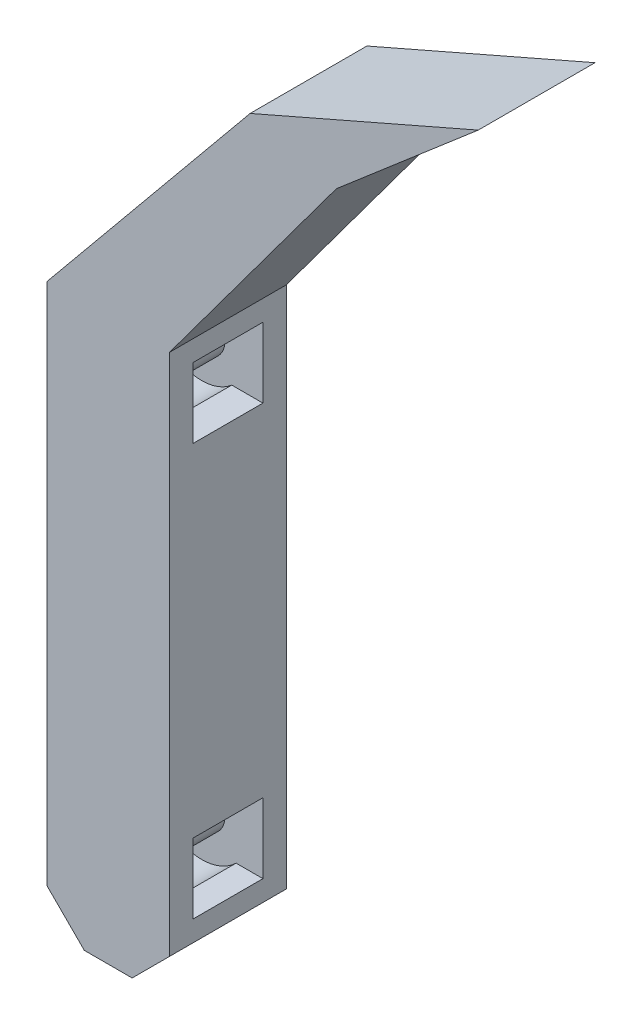
ISO-10303-21;
HEADER;
FILE_DESCRIPTION(('STEP AP214'),'2;1');
FILE_NAME('part.step','',(''),(''),'','','');
FILE_SCHEMA(('AUTOMOTIVE_DESIGN { 1 0 10303 214 1 1 1 1 }'));
ENDSEC;
DATA;
#1=APPLICATION_CONTEXT('core data for automotive mechanical design processes');
#2=APPLICATION_PROTOCOL_DEFINITION('international standard','automotive_design',2000,#1);
#3=PRODUCT_CONTEXT('',#1,'mechanical');
#4=PRODUCT('Part','Part','',(#3));
#5=PRODUCT_RELATED_PRODUCT_CATEGORY('part','',(#4));
#6=PRODUCT_DEFINITION_FORMATION('','',#4);
#7=PRODUCT_DEFINITION_CONTEXT('part definition',#1,'design');
#8=PRODUCT_DEFINITION('design','',#6,#7);
#9=PRODUCT_DEFINITION_SHAPE('','',#8);
#10=(LENGTH_UNIT() NAMED_UNIT(*) SI_UNIT(.MILLI.,.METRE.));
#11=(NAMED_UNIT(*) PLANE_ANGLE_UNIT() SI_UNIT($,.RADIAN.));
#12=(NAMED_UNIT(*) SI_UNIT($,.STERADIAN.) SOLID_ANGLE_UNIT());
#13=UNCERTAINTY_MEASURE_WITH_UNIT(LENGTH_MEASURE(1.E-05),#10,'distance_accuracy_value','');
#14=(GEOMETRIC_REPRESENTATION_CONTEXT(3) GLOBAL_UNCERTAINTY_ASSIGNED_CONTEXT((#13)) GLOBAL_UNIT_ASSIGNED_CONTEXT((#10,
#11,#12)) REPRESENTATION_CONTEXT('',''));
#15=CARTESIAN_POINT('',(0.,0.,0.));
#16=DIRECTION('',(0.,0.,1.));
#17=DIRECTION('',(1.,0.,0.));
#18=AXIS2_PLACEMENT_3D('',#15,#16,#17);
#19=CARTESIAN_POINT('',(82.7839757560862,68.0338828579903,0.));
#20=DIRECTION('',(0.,1.,0.));
#21=DIRECTION('',(-1.,0.,0.));
#22=AXIS2_PLACEMENT_3D('',#19,#20,#21);
#23=PLANE('',#22);
#24=DIRECTION('',(-1.,0.,0.));
#25=VECTOR('',#24,1.);
#26=CARTESIAN_POINT('',(82.7839757560862,68.0338828579903,5.));
#27=LINE('',#26,#25);
#28=CARTESIAN_POINT('',(16.6884969003966,68.0338828579902,5.));
#29=VERTEX_POINT('',#28);
#30=CARTESIAN_POINT('',(10.0168187006389,68.0338828579902,5.));
#31=VERTEX_POINT('',#30);
#32=EDGE_CURVE('E246',#29,#31,#27,.T.);
#33=ORIENTED_EDGE('',*,*,#32,.T.);
#34=DIRECTION('',(0.,0.,-1.));
#35=VECTOR('',#34,1.);
#36=CARTESIAN_POINT('',(10.0168187006389,68.0338828579902,20.));
#37=LINE('',#36,#35);
#38=CARTESIAN_POINT('',(10.0168187006389,68.0338828579902,20.));
#39=VERTEX_POINT('',#38);
#40=EDGE_CURVE('E465',#31,#39,#37,.F.);
#41=ORIENTED_EDGE('',*,*,#40,.T.);
#42=DIRECTION('',(-1.,0.,0.));
#43=VECTOR('',#42,1.);
#44=CARTESIAN_POINT('',(82.7839757560862,68.0338828579903,20.));
#45=LINE('',#44,#43);
#46=CARTESIAN_POINT('',(16.6884969003966,68.0338828579902,20.));
#47=VERTEX_POINT('',#46);
#48=EDGE_CURVE('E253',#47,#39,#45,.T.);
#49=ORIENTED_EDGE('',*,*,#48,.F.);
#50=DIRECTION('',(0.,0.,1.));
#51=VECTOR('',#50,1.);
#52=CARTESIAN_POINT('',(16.6884969003966,68.0338828579902,25.));
#53=LINE('',#52,#51);
#54=EDGE_CURVE('E267',#29,#47,#53,.T.);
#55=ORIENTED_EDGE('',*,*,#54,.F.);
#56=EDGE_LOOP('',(#33,#41,#49,#55));
#57=FACE_BOUND('',#56,.T.);
#58=ADVANCED_FACE('F49',(#57),#23,.T.);
#59=CARTESIAN_POINT('',(-2.8794422184024,68.0338828579902,20.));
#60=VERTEX_POINT('',#59);
#61=CARTESIAN_POINT('',(-9.55112041816008,68.0338828579902,20.));
#62=VERTEX_POINT('',#61);
#63=EDGE_CURVE('E257',#60,#62,#45,.T.);
#64=ORIENTED_EDGE('',*,*,#63,.F.);
#65=DIRECTION('',(0.,0.,-1.));
#66=VECTOR('',#65,1.);
#67=CARTESIAN_POINT('',(-2.87944221840239,68.0338828579902,20.));
#68=LINE('',#67,#66);
#69=CARTESIAN_POINT('',(-2.8794422184024,68.0338828579902,4.99999999999999));
#70=VERTEX_POINT('',#69);
#71=EDGE_CURVE('E480',#60,#70,#68,.T.);
#72=ORIENTED_EDGE('',*,*,#71,.T.);
#73=CARTESIAN_POINT('',(-9.55112041816008,68.0338828579902,5.));
#74=VERTEX_POINT('',#73);
#75=EDGE_CURVE('E241',#70,#74,#27,.T.);
#76=ORIENTED_EDGE('',*,*,#75,.T.);
#77=DIRECTION('',(0.,0.,-1.));
#78=VECTOR('',#77,1.);
#79=CARTESIAN_POINT('',(-9.55112041816008,68.0338828579902,0.));
#80=LINE('',#79,#78);
#81=EDGE_CURVE('E491',#62,#74,#80,.T.);
#82=ORIENTED_EDGE('',*,*,#81,.F.);
#83=EDGE_LOOP('',(#64,#72,#76,#82));
#84=FACE_BOUND('',#83,.T.);
#85=ADVANCED_FACE('F514',(#84),#23,.T.);
#86=CARTESIAN_POINT('',(82.7839757560862,83.0338828579903,0.));
#87=DIRECTION('',(0.,-1.,0.));
#88=DIRECTION('',(1.,0.,0.));
#89=AXIS2_PLACEMENT_3D('',#86,#87,#88);
#90=PLANE('',#89);
#91=DIRECTION('',(-1.,0.,0.));
#92=VECTOR('',#91,1.);
#93=CARTESIAN_POINT('',(82.7839757560862,83.0338828579903,5.));
#94=LINE('',#93,#92);
#95=CARTESIAN_POINT('',(-2.87944221840239,83.0338828579903,5.));
#96=VERTEX_POINT('',#95);
#97=CARTESIAN_POINT('',(-9.55112041816008,83.0338828579903,5.));
#98=VERTEX_POINT('',#97);
#99=EDGE_CURVE('E242',#96,#98,#94,.T.);
#100=ORIENTED_EDGE('',*,*,#99,.F.);
#101=DIRECTION('',(0.,0.,-1.));
#102=VECTOR('',#101,1.);
#103=CARTESIAN_POINT('',(-2.8794422184024,83.0338828579903,20.));
#104=LINE('',#103,#102);
#105=CARTESIAN_POINT('',(-2.87944221840239,83.0338828579903,20.));
#106=VERTEX_POINT('',#105);
#107=EDGE_CURVE('E220',#96,#106,#104,.F.);
#108=ORIENTED_EDGE('',*,*,#107,.T.);
#109=DIRECTION('',(-1.,0.,0.));
#110=VECTOR('',#109,1.);
#111=CARTESIAN_POINT('',(82.7839757560862,83.0338828579903,20.));
#112=LINE('',#111,#110);
#113=CARTESIAN_POINT('',(-9.55112041816008,83.0338828579903,20.));
#114=VERTEX_POINT('',#113);
#115=EDGE_CURVE('E252',#106,#114,#112,.T.);
#116=ORIENTED_EDGE('',*,*,#115,.T.);
#117=DIRECTION('',(0.,0.,1.));
#118=VECTOR('',#117,1.);
#119=CARTESIAN_POINT('',(-9.55112041816008,83.0338828579903,0.));
#120=LINE('',#119,#118);
#121=EDGE_CURVE('E502',#98,#114,#120,.T.);
#122=ORIENTED_EDGE('',*,*,#121,.F.);
#123=EDGE_LOOP('',(#100,#108,#116,#122));
#124=FACE_BOUND('',#123,.T.);
#125=ADVANCED_FACE('F518',(#124),#90,.T.);
#126=CARTESIAN_POINT('',(16.6884969003966,83.0338828579903,20.));
#127=VERTEX_POINT('',#126);
#128=CARTESIAN_POINT('',(10.0168187006389,83.0338828579903,20.));
#129=VERTEX_POINT('',#128);
#130=EDGE_CURVE('E232',#127,#129,#112,.T.);
#131=ORIENTED_EDGE('',*,*,#130,.T.);
#132=DIRECTION('',(0.,0.,-1.));
#133=VECTOR('',#132,1.);
#134=CARTESIAN_POINT('',(10.0168187006389,83.0338828579903,20.));
#135=LINE('',#134,#133);
#136=CARTESIAN_POINT('',(10.0168187006389,83.0338828579903,4.99999999999999));
#137=VERTEX_POINT('',#136);
#138=EDGE_CURVE('E217',#129,#137,#135,.T.);
#139=ORIENTED_EDGE('',*,*,#138,.T.);
#140=CARTESIAN_POINT('',(16.6884969003966,83.0338828579903,5.));
#141=VERTEX_POINT('',#140);
#142=EDGE_CURVE('E230',#141,#137,#94,.T.);
#143=ORIENTED_EDGE('',*,*,#142,.F.);
#144=DIRECTION('',(0.,0.,-1.));
#145=VECTOR('',#144,1.);
#146=CARTESIAN_POINT('',(16.6884969003966,83.0338828579903,25.));
#147=LINE('',#146,#145);
#148=EDGE_CURVE('E262',#127,#141,#147,.T.);
#149=ORIENTED_EDGE('',*,*,#148,.F.);
#150=EDGE_LOOP('',(#131,#139,#143,#149));
#151=FACE_BOUND('',#150,.T.);
#152=ADVANCED_FACE('F228',(#151),#90,.T.);
#153=CARTESIAN_POINT('',(16.6884969003966,0.,25.));
#154=DIRECTION('',(1.,0.,0.));
#155=DIRECTION('',(0.,1.,0.));
#156=AXIS2_PLACEMENT_3D('',#153,#154,#155);
#157=PLANE('',#156);
#158=DIRECTION('',(0.,-1.,0.));
#159=VECTOR('',#158,1.);
#160=CARTESIAN_POINT('',(16.6884969003966,0.,20.));
#161=LINE('',#160,#159);
#162=CARTESIAN_POINT('',(16.6884969003966,-5.12722600718291,20.));
#163=VERTEX_POINT('',#162);
#164=CARTESIAN_POINT('',(16.6884969003967,-20.1272260071829,20.));
#165=VERTEX_POINT('',#164);
#166=EDGE_CURVE('E332',#163,#165,#161,.T.);
#167=ORIENTED_EDGE('',*,*,#166,.F.);
#168=DIRECTION('',(0.,0.,1.));
#169=VECTOR('',#168,1.);
#170=CARTESIAN_POINT('',(16.6884969003966,-5.12722600718291,25.));
#171=LINE('',#170,#169);
#172=CARTESIAN_POINT('',(16.6884969003966,-5.12722600718291,5.));
#173=VERTEX_POINT('',#172);
#174=EDGE_CURVE('E307',#173,#163,#171,.T.);
#175=ORIENTED_EDGE('',*,*,#174,.F.);
#176=DIRECTION('',(0.,1.,0.));
#177=VECTOR('',#176,1.);
#178=CARTESIAN_POINT('',(16.6884969003966,0.,5.));
#179=LINE('',#178,#177);
#180=CARTESIAN_POINT('',(16.6884969003967,-20.1272260071829,5.));
#181=VERTEX_POINT('',#180);
#182=EDGE_CURVE('E325',#181,#173,#179,.T.);
#183=ORIENTED_EDGE('',*,*,#182,.F.);
#184=DIRECTION('',(0.,0.,-1.));
#185=VECTOR('',#184,1.);
#186=CARTESIAN_POINT('',(16.6884969003967,-20.1272260071829,25.));
#187=LINE('',#186,#185);
#188=EDGE_CURVE('E329',#165,#181,#187,.T.);
#189=ORIENTED_EDGE('',*,*,#188,.F.);
#190=EDGE_LOOP('',(#167,#175,#183,#189));
#191=FACE_BOUND('',#190,.T.);
#192=DIRECTION('',(0.,-1.,0.));
#193=VECTOR('',#192,1.);
#194=CARTESIAN_POINT('',(16.6884969003966,0.,25.));
#195=LINE('',#194,#193);
#196=CARTESIAN_POINT('',(16.6884969003966,87.4533284254036,25.));
#197=VERTEX_POINT('',#196);
#198=CARTESIAN_POINT('',(16.6884969003967,-24.5466715745963,25.));
#199=VERTEX_POINT('',#198);
#200=EDGE_CURVE('E336',#197,#199,#195,.T.);
#201=ORIENTED_EDGE('',*,*,#200,.T.);
#202=DIRECTION('',(0.,0.,-1.));
#203=VECTOR('',#202,1.);
#204=CARTESIAN_POINT('',(16.6884969003967,-24.5466715745963,0.));
#205=LINE('',#204,#203);
#206=CARTESIAN_POINT('',(16.6884969003967,-24.5466715745963,0.));
#207=VERTEX_POINT('',#206);
#208=EDGE_CURVE('E406',#199,#207,#205,.T.);
#209=ORIENTED_EDGE('',*,*,#208,.T.);
#210=DIRECTION('',(0.,-1.,0.));
#211=VECTOR('',#210,1.);
#212=CARTESIAN_POINT('',(16.6884969003966,0.,0.));
#213=LINE('',#212,#211);
#214=CARTESIAN_POINT('',(16.6884969003966,87.4533284254036,0.));
#215=VERTEX_POINT('',#214);
#216=EDGE_CURVE('E335',#215,#207,#213,.T.);
#217=ORIENTED_EDGE('',*,*,#216,.F.);
#218=DIRECTION('',(0.,0.,-1.));
#219=VECTOR('',#218,1.);
#220=CARTESIAN_POINT('',(16.6884969003966,87.4533284254036,25.));
#221=LINE('',#220,#219);
#222=EDGE_CURVE('E403',#197,#215,#221,.T.);
#223=ORIENTED_EDGE('',*,*,#222,.F.);
#224=EDGE_LOOP('',(#201,#209,#217,#223));
#225=FACE_BOUND('',#224,.T.);
#226=DIRECTION('',(0.,-1.,0.));
#227=VECTOR('',#226,1.);
#228=CARTESIAN_POINT('',(16.6884969003966,0.,4.99999999999999));
#229=LINE('',#228,#227);
#230=EDGE_CURVE('E239',#141,#29,#229,.T.);
#231=ORIENTED_EDGE('',*,*,#230,.T.);
#232=ORIENTED_EDGE('',*,*,#54,.T.);
#233=DIRECTION('',(0.,1.,0.));
#234=VECTOR('',#233,1.);
#235=CARTESIAN_POINT('',(16.6884969003966,0.,20.));
#236=LINE('',#235,#234);
#237=EDGE_CURVE('E258',#47,#127,#236,.T.);
#238=ORIENTED_EDGE('',*,*,#237,.T.);
#239=ORIENTED_EDGE('',*,*,#148,.T.);
#240=EDGE_LOOP('',(#231,#232,#238,#239));
#241=FACE_BOUND('',#240,.T.);
#242=ADVANCED_FACE('F467',(#191,#225,#241),#157,.T.);
#243=CARTESIAN_POINT('',(-9.55112041816007,0.,25.));
#244=DIRECTION('',(1.,0.,0.));
#245=DIRECTION('',(0.,1.,0.));
#246=AXIS2_PLACEMENT_3D('',#243,#244,#245);
#247=PLANE('',#246);
#248=DIRECTION('',(0.,-1.,0.));
#249=VECTOR('',#248,1.);
#250=CARTESIAN_POINT('',(-9.55112041816007,0.,0.));
#251=LINE('',#250,#249);
#252=CARTESIAN_POINT('',(-9.55112041816009,87.4533284254036,0.));
#253=VERTEX_POINT('',#252);
#254=CARTESIAN_POINT('',(-9.55112041816007,-24.5466715745963,0.));
#255=VERTEX_POINT('',#254);
#256=EDGE_CURVE('E385',#253,#255,#251,.T.);
#257=ORIENTED_EDGE('',*,*,#256,.T.);
#258=DIRECTION('',(0.,0.,1.));
#259=VECTOR('',#258,1.);
#260=CARTESIAN_POINT('',(-9.55112041816007,-24.5466715745963,25.));
#261=LINE('',#260,#259);
#262=CARTESIAN_POINT('',(-9.55112041816007,-24.5466715745963,25.));
#263=VERTEX_POINT('',#262);
#264=EDGE_CURVE('E429',#255,#263,#261,.T.);
#265=ORIENTED_EDGE('',*,*,#264,.T.);
#266=DIRECTION('',(0.,-1.,0.));
#267=VECTOR('',#266,1.);
#268=CARTESIAN_POINT('',(-9.55112041816007,0.,25.));
#269=LINE('',#268,#267);
#270=CARTESIAN_POINT('',(-9.55112041816009,87.4533284254036,25.));
#271=VERTEX_POINT('',#270);
#272=EDGE_CURVE('E357',#271,#263,#269,.T.);
#273=ORIENTED_EDGE('',*,*,#272,.F.);
#274=DIRECTION('',(0.,0.,-1.));
#275=VECTOR('',#274,1.);
#276=CARTESIAN_POINT('',(-9.55112041816009,87.4533284254036,25.));
#277=LINE('',#276,#275);
#278=EDGE_CURVE('E365',#271,#253,#277,.T.);
#279=ORIENTED_EDGE('',*,*,#278,.T.);
#280=EDGE_LOOP('',(#257,#265,#273,#279));
#281=FACE_BOUND('',#280,.T.);
#282=DIRECTION('',(0.,0.,-1.));
#283=VECTOR('',#282,1.);
#284=CARTESIAN_POINT('',(-9.55112041816007,-5.12722600718291,5.));
#285=LINE('',#284,#283);
#286=CARTESIAN_POINT('',(-9.55112041816007,-5.12722600718291,20.));
#287=VERTEX_POINT('',#286);
#288=CARTESIAN_POINT('',(-9.55112041816007,-5.12722600718291,5.));
#289=VERTEX_POINT('',#288);
#290=EDGE_CURVE('E290',#287,#289,#285,.T.);
#291=ORIENTED_EDGE('',*,*,#290,.F.);
#292=DIRECTION('',(0.,1.,0.));
#293=VECTOR('',#292,1.);
#294=CARTESIAN_POINT('',(-9.55112041816007,-5.12722600718291,20.));
#295=LINE('',#294,#293);
#296=CARTESIAN_POINT('',(-9.55112041816007,-20.1272260071829,20.));
#297=VERTEX_POINT('',#296);
#298=EDGE_CURVE('E286',#297,#287,#295,.T.);
#299=ORIENTED_EDGE('',*,*,#298,.F.);
#300=DIRECTION('',(0.,0.,1.));
#301=VECTOR('',#300,1.);
#302=CARTESIAN_POINT('',(-9.55112041816007,-20.1272260071829,5.));
#303=LINE('',#302,#301);
#304=CARTESIAN_POINT('',(-9.55112041816007,-20.1272260071829,5.));
#305=VERTEX_POINT('',#304);
#306=EDGE_CURVE('E298',#305,#297,#303,.T.);
#307=ORIENTED_EDGE('',*,*,#306,.F.);
#308=DIRECTION('',(0.,-1.,0.));
#309=VECTOR('',#308,1.);
#310=CARTESIAN_POINT('',(-9.55112041816007,-5.12722600718291,5.));
#311=LINE('',#310,#309);
#312=EDGE_CURVE('E294',#289,#305,#311,.T.);
#313=ORIENTED_EDGE('',*,*,#312,.F.);
#314=EDGE_LOOP('',(#291,#299,#307,#313));
#315=FACE_BOUND('',#314,.T.);
#316=ORIENTED_EDGE('',*,*,#81,.T.);
#317=DIRECTION('',(0.,1.,0.));
#318=VECTOR('',#317,1.);
#319=CARTESIAN_POINT('',(-9.55112041816007,0.,4.99999999999999));
#320=LINE('',#319,#318);
#321=EDGE_CURVE('E505',#74,#98,#320,.T.);
#322=ORIENTED_EDGE('',*,*,#321,.T.);
#323=ORIENTED_EDGE('',*,*,#121,.T.);
#324=DIRECTION('',(0.,-1.,0.));
#325=VECTOR('',#324,1.);
#326=CARTESIAN_POINT('',(-9.55112041816007,0.,20.));
#327=LINE('',#326,#325);
#328=EDGE_CURVE('E498',#114,#62,#327,.T.);
#329=ORIENTED_EDGE('',*,*,#328,.T.);
#330=EDGE_LOOP('',(#316,#322,#323,#329));
#331=FACE_BOUND('',#330,.T.);
#332=ADVANCED_FACE('F515',(#281,#315,#331),#247,.F.);
#333=CARTESIAN_POINT('',(25.4488795818399,-20.1272260071829,5.));
#334=DIRECTION('',(0.,-1.,0.));
#335=DIRECTION('',(1.,0.,0.));
#336=AXIS2_PLACEMENT_3D('',#333,#334,#335);
#337=PLANE('',#336);
#338=DIRECTION('',(0.,0.,-1.));
#339=VECTOR('',#338,1.);
#340=CARTESIAN_POINT('',(-3.79901047374004,-20.1272260071829,20.));
#341=LINE('',#340,#339);
#342=CARTESIAN_POINT('',(-3.79901047374004,-20.1272260071829,5.));
#343=VERTEX_POINT('',#342);
#344=CARTESIAN_POINT('',(-3.79901047374004,-20.1272260071829,20.));
#345=VERTEX_POINT('',#344);
#346=EDGE_CURVE('E283',#343,#345,#341,.F.);
#347=ORIENTED_EDGE('',*,*,#346,.F.);
#348=DIRECTION('',(-1.,0.,0.));
#349=VECTOR('',#348,1.);
#350=CARTESIAN_POINT('',(25.4488795818399,-20.1272260071829,5.));
#351=LINE('',#350,#349);
#352=EDGE_CURVE('E313',#343,#305,#351,.T.);
#353=ORIENTED_EDGE('',*,*,#352,.T.);
#354=ORIENTED_EDGE('',*,*,#306,.T.);
#355=DIRECTION('',(-1.,0.,0.));
#356=VECTOR('',#355,1.);
#357=CARTESIAN_POINT('',(25.4488795818399,-20.1272260071829,20.));
#358=LINE('',#357,#356);
#359=EDGE_CURVE('E308',#345,#297,#358,.T.);
#360=ORIENTED_EDGE('',*,*,#359,.F.);
#361=EDGE_LOOP('',(#347,#353,#354,#360));
#362=FACE_BOUND('',#361,.T.);
#363=ADVANCED_FACE('F542',(#362),#337,.F.);
#364=DIRECTION('',(0.,0.,-1.));
#365=VECTOR('',#364,1.);
#366=CARTESIAN_POINT('',(10.9363869559766,-20.1272260071829,20.));
#367=LINE('',#366,#365);
#368=CARTESIAN_POINT('',(10.9363869559766,-20.1272260071829,20.));
#369=VERTEX_POINT('',#368);
#370=CARTESIAN_POINT('',(10.9363869559766,-20.1272260071829,5.));
#371=VERTEX_POINT('',#370);
#372=EDGE_CURVE('E275',#369,#371,#367,.T.);
#373=ORIENTED_EDGE('',*,*,#372,.F.);
#374=EDGE_CURVE('E303',#165,#369,#358,.T.);
#375=ORIENTED_EDGE('',*,*,#374,.F.);
#376=ORIENTED_EDGE('',*,*,#188,.T.);
#377=EDGE_CURVE('E309',#181,#371,#351,.T.);
#378=ORIENTED_EDGE('',*,*,#377,.T.);
#379=EDGE_LOOP('',(#373,#375,#376,#378));
#380=FACE_BOUND('',#379,.T.);
#381=ADVANCED_FACE('F545',(#380),#337,.F.);
#382=CARTESIAN_POINT('',(25.4488795818399,-5.12722600718291,5.));
#383=DIRECTION('',(0.,1.,0.));
#384=DIRECTION('',(-1.,0.,0.));
#385=AXIS2_PLACEMENT_3D('',#382,#383,#384);
#386=PLANE('',#385);
#387=DIRECTION('',(0.,0.,-1.));
#388=VECTOR('',#387,1.);
#389=CARTESIAN_POINT('',(10.9363869559766,-5.12722600718291,20.));
#390=LINE('',#389,#388);
#391=CARTESIAN_POINT('',(10.9363869559766,-5.12722600718291,5.));
#392=VERTEX_POINT('',#391);
#393=CARTESIAN_POINT('',(10.9363869559766,-5.12722600718291,20.));
#394=VERTEX_POINT('',#393);
#395=EDGE_CURVE('E11',#392,#394,#390,.F.);
#396=ORIENTED_EDGE('',*,*,#395,.F.);
#397=DIRECTION('',(-1.,0.,0.));
#398=VECTOR('',#397,1.);
#399=CARTESIAN_POINT('',(25.4488795818399,-5.12722600718291,5.));
#400=LINE('',#399,#398);
#401=EDGE_CURVE('E314',#173,#392,#400,.T.);
#402=ORIENTED_EDGE('',*,*,#401,.F.);
#403=ORIENTED_EDGE('',*,*,#174,.T.);
#404=DIRECTION('',(-1.,0.,0.));
#405=VECTOR('',#404,1.);
#406=CARTESIAN_POINT('',(25.4488795818399,-5.12722600718291,20.));
#407=LINE('',#406,#405);
#408=EDGE_CURVE('E319',#163,#394,#407,.T.);
#409=ORIENTED_EDGE('',*,*,#408,.T.);
#410=EDGE_LOOP('',(#396,#402,#403,#409));
#411=FACE_BOUND('',#410,.T.);
#412=ADVANCED_FACE('F551',(#411),#386,.F.);
#413=DIRECTION('',(0.,0.,-1.));
#414=VECTOR('',#413,1.);
#415=CARTESIAN_POINT('',(-3.79901047374005,-5.12722600718291,20.));
#416=LINE('',#415,#414);
#417=CARTESIAN_POINT('',(-3.79901047374005,-5.12722600718291,20.));
#418=VERTEX_POINT('',#417);
#419=CARTESIAN_POINT('',(-3.79901047374005,-5.12722600718291,5.));
#420=VERTEX_POINT('',#419);
#421=EDGE_CURVE('E59',#418,#420,#416,.T.);
#422=ORIENTED_EDGE('',*,*,#421,.F.);
#423=EDGE_CURVE('E302',#418,#287,#407,.T.);
#424=ORIENTED_EDGE('',*,*,#423,.T.);
#425=ORIENTED_EDGE('',*,*,#290,.T.);
#426=EDGE_CURVE('E318',#420,#289,#400,.T.);
#427=ORIENTED_EDGE('',*,*,#426,.F.);
#428=EDGE_LOOP('',(#422,#424,#425,#427));
#429=FACE_BOUND('',#428,.T.);
#430=ADVANCED_FACE('F451',(#429),#386,.F.);
#431=CARTESIAN_POINT('',(-31.0699093713499,23.0343514229941,25.));
#432=DIRECTION('',(0.803314697741156,-0.595554780346053,0.));
#433=DIRECTION('',(0.595554780346053,0.803314697741156,0.));
#434=AXIS2_PLACEMENT_3D('',#431,#432,#433);
#435=PLANE('',#434);
#436=DIRECTION('',(-0.595554780346053,-0.803314697741156,0.));
#437=VECTOR('',#436,1.);
#438=CARTESIAN_POINT('',(-31.0699093713499,23.0343514229941,0.));
#439=LINE('',#438,#437);
#440=CARTESIAN_POINT('',(52.4217837211598,135.652210289873,0.));
#441=VERTEX_POINT('',#440);
#442=EDGE_CURVE('E369',#441,#215,#439,.T.);
#443=ORIENTED_EDGE('',*,*,#442,.F.);
#444=DIRECTION('',(0.,0.,-1.));
#445=VECTOR('',#444,1.);
#446=CARTESIAN_POINT('',(52.4217837211598,135.652210289873,25.));
#447=LINE('',#446,#445);
#448=CARTESIAN_POINT('',(52.4217837211598,135.652210289873,25.));
#449=VERTEX_POINT('',#448);
#450=EDGE_CURVE('E400',#449,#441,#447,.T.);
#451=ORIENTED_EDGE('',*,*,#450,.F.);
#452=DIRECTION('',(-0.595554780346053,-0.803314697741156,0.));
#453=VECTOR('',#452,1.);
#454=CARTESIAN_POINT('',(-31.0699093713499,23.0343514229941,25.));
#455=LINE('',#454,#453);
#456=EDGE_CURVE('E340',#449,#197,#455,.T.);
#457=ORIENTED_EDGE('',*,*,#456,.T.);
#458=ORIENTED_EDGE('',*,*,#222,.T.);
#459=EDGE_LOOP('',(#443,#451,#457,#458));
#460=FACE_BOUND('',#459,.T.);
#461=ADVANCED_FACE('F585',(#460),#435,.T.);
#462=CARTESIAN_POINT('',(-44.8163410921845,52.2529368631536,25.));
#463=DIRECTION('',(0.651026734682538,-0.759054800873159,0.));
#464=DIRECTION('',(0.759054800873159,0.651026734682538,0.));
#465=AXIS2_PLACEMENT_3D('',#462,#463,#464);
#466=PLANE('',#465);
#467=DIRECTION('',(-0.75905480087316,-0.651026734682538,0.));
#468=VECTOR('',#467,1.);
#469=CARTESIAN_POINT('',(-44.8163410921845,52.2529368631536,0.));
#470=LINE('',#469,#468);
#471=CARTESIAN_POINT('',(82.7839757560862,161.693279677175,0.));
#472=VERTEX_POINT('',#471);
#473=EDGE_CURVE('E373',#472,#441,#470,.T.);
#474=ORIENTED_EDGE('',*,*,#473,.F.);
#475=DIRECTION('',(0.,0.,-1.));
#476=VECTOR('',#475,1.);
#477=CARTESIAN_POINT('',(82.7839757560862,161.693279677175,25.));
#478=LINE('',#477,#476);
#479=CARTESIAN_POINT('',(82.7839757560862,161.693279677175,25.));
#480=VERTEX_POINT('',#479);
#481=EDGE_CURVE('E397',#480,#472,#478,.T.);
#482=ORIENTED_EDGE('',*,*,#481,.F.);
#483=DIRECTION('',(-0.75905480087316,-0.651026734682538,0.));
#484=VECTOR('',#483,1.);
#485=CARTESIAN_POINT('',(-44.8163410921845,52.2529368631536,25.));
#486=LINE('',#485,#484);
#487=EDGE_CURVE('E345',#480,#449,#486,.T.);
#488=ORIENTED_EDGE('',*,*,#487,.T.);
#489=ORIENTED_EDGE('',*,*,#450,.T.);
#490=EDGE_LOOP('',(#474,#482,#488,#489));
#491=FACE_BOUND('',#490,.T.);
#492=ADVANCED_FACE('F581',(#491),#466,.T.);
#493=CARTESIAN_POINT('',(-46.0432629829458,105.434294069161,25.));
#494=DIRECTION('',(-0.400204165196489,0.916426006920025,0.));
#495=DIRECTION('',(-0.916426006920025,-0.400204165196489,0.));
#496=AXIS2_PLACEMENT_3D('',#493,#494,#495);
#497=PLANE('',#496);
#498=DIRECTION('',(0.916426006920025,0.400204165196489,0.));
#499=VECTOR('',#498,1.);
#500=CARTESIAN_POINT('',(-46.0432629829458,105.434294069161,0.));
#501=LINE('',#500,#499);
#502=CARTESIAN_POINT('',(33.9442939659707,140.364941184287,0.));
#503=VERTEX_POINT('',#502);
#504=EDGE_CURVE('E377',#503,#472,#501,.T.);
#505=ORIENTED_EDGE('',*,*,#504,.F.);
#506=DIRECTION('',(0.,0.,-1.));
#507=VECTOR('',#506,1.);
#508=CARTESIAN_POINT('',(33.9442939659707,140.364941184287,25.));
#509=LINE('',#508,#507);
#510=CARTESIAN_POINT('',(33.9442939659707,140.364941184287,25.));
#511=VERTEX_POINT('',#510);
#512=EDGE_CURVE('E394',#511,#503,#509,.T.);
#513=ORIENTED_EDGE('',*,*,#512,.F.);
#514=DIRECTION('',(0.916426006920025,0.400204165196489,0.));
#515=VECTOR('',#514,1.);
#516=CARTESIAN_POINT('',(-46.0432629829458,105.434294069161,25.));
#517=LINE('',#516,#515);
#518=EDGE_CURVE('E349',#511,#480,#517,.T.);
#519=ORIENTED_EDGE('',*,*,#518,.T.);
#520=ORIENTED_EDGE('',*,*,#481,.T.);
#521=EDGE_LOOP('',(#505,#513,#519,#520));
#522=FACE_BOUND('',#521,.T.);
#523=ADVANCED_FACE('F577',(#522),#497,.T.);
#524=CARTESIAN_POINT('',(-48.599886191833,39.9510065695449,25.));
#525=DIRECTION('',(-0.77249487917604,0.635020993075658,0.));
#526=DIRECTION('',(-0.635020993075658,-0.77249487917604,0.));
#527=AXIS2_PLACEMENT_3D('',#524,#525,#526);
#528=PLANE('',#527);
#529=DIRECTION('',(0.635020993075658,0.77249487917604,0.));
#530=VECTOR('',#529,1.);
#531=CARTESIAN_POINT('',(-48.599886191833,39.9510065695449,0.));
#532=LINE('',#531,#530);
#533=EDGE_CURVE('E381',#253,#503,#532,.T.);
#534=ORIENTED_EDGE('',*,*,#533,.F.);
#535=ORIENTED_EDGE('',*,*,#278,.F.);
#536=DIRECTION('',(0.635020993075658,0.77249487917604,0.));
#537=VECTOR('',#536,1.);
#538=CARTESIAN_POINT('',(-48.599886191833,39.9510065695449,25.));
#539=LINE('',#538,#537);
#540=EDGE_CURVE('E353',#271,#511,#539,.T.);
#541=ORIENTED_EDGE('',*,*,#540,.T.);
#542=ORIENTED_EDGE('',*,*,#512,.T.);
#543=EDGE_LOOP('',(#534,#535,#541,#542));
#544=FACE_BOUND('',#543,.T.);
#545=ADVANCED_FACE('F570',(#544),#528,.T.);
#546=CARTESIAN_POINT('',(0.,-32.5466715745964,25.));
#547=DIRECTION('',(0.,1.,0.));
#548=DIRECTION('',(0.,0.,1.));
#549=AXIS2_PLACEMENT_3D('',#546,#547,#548);
#550=PLANE('',#549);
#551=DIRECTION('',(1.,0.,0.));
#552=VECTOR('',#551,1.);
#553=CARTESIAN_POINT('',(0.,-32.5466715745964,0.));
#554=LINE('',#553,#552);
#555=CARTESIAN_POINT('',(-1.55112041816001,-32.5466715745964,0.));
#556=VERTEX_POINT('',#555);
#557=CARTESIAN_POINT('',(8.68849690039659,-32.5466715745964,0.));
#558=VERTEX_POINT('',#557);
#559=EDGE_CURVE('E341',#556,#558,#554,.T.);
#560=ORIENTED_EDGE('',*,*,#559,.T.);
#561=DIRECTION('',(0.,0.,1.));
#562=VECTOR('',#561,1.);
#563=CARTESIAN_POINT('',(8.68849690039659,-32.5466715745964,25.));
#564=LINE('',#563,#562);
#565=CARTESIAN_POINT('',(8.68849690039659,-32.5466715745964,25.));
#566=VERTEX_POINT('',#565);
#567=EDGE_CURVE('E420',#558,#566,#564,.T.);
#568=ORIENTED_EDGE('',*,*,#567,.T.);
#569=DIRECTION('',(1.,0.,0.));
#570=VECTOR('',#569,1.);
#571=CARTESIAN_POINT('',(0.,-32.5466715745964,25.));
#572=LINE('',#571,#570);
#573=CARTESIAN_POINT('',(-1.55112041816001,-32.5466715745964,25.));
#574=VERTEX_POINT('',#573);
#575=EDGE_CURVE('E361',#574,#566,#572,.T.);
#576=ORIENTED_EDGE('',*,*,#575,.F.);
#577=DIRECTION('',(0.,0.,-1.));
#578=VECTOR('',#577,1.);
#579=CARTESIAN_POINT('',(-1.55112041816001,-32.5466715745964,25.));
#580=LINE('',#579,#578);
#581=EDGE_CURVE('E416',#574,#556,#580,.T.);
#582=ORIENTED_EDGE('',*,*,#581,.T.);
#583=EDGE_LOOP('',(#560,#568,#576,#582));
#584=FACE_BOUND('',#583,.T.);
#585=ADVANCED_FACE('F562',(#584),#550,.F.);
#586=CARTESIAN_POINT('',(0.,0.,25.));
#587=DIRECTION('',(0.,0.,1.));
#588=DIRECTION('',(1.,0.,0.));
#589=AXIS2_PLACEMENT_3D('',#586,#587,#588);
#590=PLANE('',#589);
#591=ORIENTED_EDGE('',*,*,#575,.T.);
#592=DIRECTION('',(0.707106781186549,0.707106781186546,0.));
#593=VECTOR('',#592,1.);
#594=CARTESIAN_POINT('',(20.6175842374965,-20.6175842374965,25.));
#595=LINE('',#594,#593);
#596=EDGE_CURVE('E426',#566,#199,#595,.T.);
#597=ORIENTED_EDGE('',*,*,#596,.T.);
#598=ORIENTED_EDGE('',*,*,#200,.F.);
#599=ORIENTED_EDGE('',*,*,#456,.F.);
#600=ORIENTED_EDGE('',*,*,#487,.F.);
#601=ORIENTED_EDGE('',*,*,#518,.F.);
#602=ORIENTED_EDGE('',*,*,#540,.F.);
#603=ORIENTED_EDGE('',*,*,#272,.T.);
#604=DIRECTION('',(-0.707106781186546,0.707106781186549,0.));
#605=VECTOR('',#604,1.);
#606=CARTESIAN_POINT('',(-17.0488959963782,-17.0488959963781,25.));
#607=LINE('',#606,#605);
#608=EDGE_CURVE('E423',#263,#574,#607,.F.);
#609=ORIENTED_EDGE('',*,*,#608,.T.);
#610=EDGE_LOOP('',(#591,#597,#598,#599,#600,#601,#602,#603,#609));
#611=FACE_BOUND('',#610,.T.);
#612=ADVANCED_FACE('F558',(#611),#590,.T.);
#613=CARTESIAN_POINT('',(0.,0.,0.));
#614=DIRECTION('',(0.,0.,1.));
#615=DIRECTION('',(1.,0.,0.));
#616=AXIS2_PLACEMENT_3D('',#613,#614,#615);
#617=PLANE('',#616);
#618=ORIENTED_EDGE('',*,*,#216,.T.);
#619=DIRECTION('',(-0.707106781186549,-0.707106781186546,0.));
#620=VECTOR('',#619,1.);
#621=CARTESIAN_POINT('',(16.6884969003967,-24.5466715745963,0.));
#622=LINE('',#621,#620);
#623=EDGE_CURVE('E413',#207,#558,#622,.T.);
#624=ORIENTED_EDGE('',*,*,#623,.T.);
#625=ORIENTED_EDGE('',*,*,#559,.F.);
#626=DIRECTION('',(0.707106781186546,-0.707106781186549,0.));
#627=VECTOR('',#626,1.);
#628=CARTESIAN_POINT('',(-1.55112041816001,-32.5466715745964,0.));
#629=LINE('',#628,#627);
#630=EDGE_CURVE('E410',#556,#255,#629,.F.);
#631=ORIENTED_EDGE('',*,*,#630,.T.);
#632=ORIENTED_EDGE('',*,*,#256,.F.);
#633=ORIENTED_EDGE('',*,*,#533,.T.);
#634=ORIENTED_EDGE('',*,*,#504,.T.);
#635=ORIENTED_EDGE('',*,*,#473,.T.);
#636=ORIENTED_EDGE('',*,*,#442,.T.);
#637=EDGE_LOOP('',(#618,#624,#625,#631,#632,#633,#634,#635,#636));
#638=FACE_BOUND('',#637,.T.);
#639=ADVANCED_FACE('F561',(#638),#617,.F.);
#640=CARTESIAN_POINT('',(16.6884969003967,-24.5466715745963,25.));
#641=DIRECTION('',(0.707106781186546,-0.707106781186549,0.));
#642=DIRECTION('',(0.,0.,1.));
#643=AXIS2_PLACEMENT_3D('',#640,#641,#642);
#644=PLANE('',#643);
#645=ORIENTED_EDGE('',*,*,#596,.F.);
#646=ORIENTED_EDGE('',*,*,#567,.F.);
#647=ORIENTED_EDGE('',*,*,#623,.F.);
#648=ORIENTED_EDGE('',*,*,#208,.F.);
#649=EDGE_LOOP('',(#645,#646,#647,#648));
#650=FACE_BOUND('',#649,.T.);
#651=ADVANCED_FACE('F566',(#650),#644,.T.);
#652=CARTESIAN_POINT('',(-1.55112041816001,-32.5466715745964,25.));
#653=DIRECTION('',(0.707106781186549,0.707106781186546,0.));
#654=DIRECTION('',(0.,0.,-1.));
#655=AXIS2_PLACEMENT_3D('',#652,#653,#654);
#656=PLANE('',#655);
#657=ORIENTED_EDGE('',*,*,#608,.F.);
#658=ORIENTED_EDGE('',*,*,#264,.F.);
#659=ORIENTED_EDGE('',*,*,#630,.F.);
#660=ORIENTED_EDGE('',*,*,#581,.F.);
#661=EDGE_LOOP('',(#657,#658,#659,#660));
#662=FACE_BOUND('',#661,.T.);
#663=ADVANCED_FACE('F52',(#662),#656,.F.);
#664=CARTESIAN_POINT('',(25.4488795818399,-5.12722600718291,20.));
#665=DIRECTION('',(0.,0.,1.));
#666=DIRECTION('',(0.,-1.,0.));
#667=AXIS2_PLACEMENT_3D('',#664,#665,#666);
#668=PLANE('',#667);
#669=CARTESIAN_POINT('',(3.56868824111829,-12.6272260071829,20.));
#670=DIRECTION('',(0.,0.,1.));
#671=DIRECTION('',(0.,-1.,0.));
#672=AXIS2_PLACEMENT_3D('',#669,#670,#671);
#673=CIRCLE('',#672,5.);
#674=CARTESIAN_POINT('',(-1.43131175888171,-12.6272260071829,20.));
#675=VERTEX_POINT('',#674);
#676=EDGE_CURVE('E436',#675,#675,#673,.F.);
#677=ORIENTED_EDGE('',*,*,#676,.F.);
#678=EDGE_LOOP('',(#677));
#679=FACE_BOUND('',#678,.T.);
#680=CARTESIAN_POINT('',(3.56868824111829,-12.6272260071829,20.));
#681=DIRECTION('',(0.,0.,1.));
#682=DIRECTION('',(1.,0.,0.));
#683=AXIS2_PLACEMENT_3D('',#680,#681,#682);
#684=CIRCLE('',#683,10.5134668094271);
#685=EDGE_CURVE('E272',#394,#418,#684,.T.);
#686=ORIENTED_EDGE('',*,*,#685,.F.);
#687=ORIENTED_EDGE('',*,*,#408,.F.);
#688=ORIENTED_EDGE('',*,*,#166,.T.);
#689=ORIENTED_EDGE('',*,*,#374,.T.);
#690=EDGE_CURVE('E276',#345,#369,#684,.T.);
#691=ORIENTED_EDGE('',*,*,#690,.F.);
#692=ORIENTED_EDGE('',*,*,#359,.T.);
#693=ORIENTED_EDGE('',*,*,#298,.T.);
#694=ORIENTED_EDGE('',*,*,#423,.F.);
#695=EDGE_LOOP('',(#686,#687,#688,#689,#691,#692,#693,#694));
#696=FACE_BOUND('',#695,.T.);
#697=ADVANCED_FACE('F549',(#679,#696),#668,.F.);
#698=CARTESIAN_POINT('',(25.4488795818399,-5.12722600718291,5.));
#699=DIRECTION('',(0.,0.,-1.));
#700=DIRECTION('',(0.,1.,0.));
#701=AXIS2_PLACEMENT_3D('',#698,#699,#700);
#702=PLANE('',#701);
#703=CARTESIAN_POINT('',(3.56868824111829,-12.6272260071829,5.));
#704=DIRECTION('',(0.,0.,-1.));
#705=DIRECTION('',(0.,1.,0.));
#706=AXIS2_PLACEMENT_3D('',#703,#704,#705);
#707=CIRCLE('',#706,5.);
#708=CARTESIAN_POINT('',(-1.43131175888171,-12.6272260071829,5.));
#709=VERTEX_POINT('',#708);
#710=EDGE_CURVE('E432',#709,#709,#707,.F.);
#711=ORIENTED_EDGE('',*,*,#710,.F.);
#712=EDGE_LOOP('',(#711));
#713=FACE_BOUND('',#712,.T.);
#714=ORIENTED_EDGE('',*,*,#352,.F.);
#715=CARTESIAN_POINT('',(3.56868824111829,-12.6272260071829,5.));
#716=DIRECTION('',(0.,0.,1.));
#717=DIRECTION('',(1.,0.,0.));
#718=AXIS2_PLACEMENT_3D('',#715,#716,#717);
#719=CIRCLE('',#718,10.5134668094271);
#720=EDGE_CURVE('E271',#343,#371,#719,.T.);
#721=ORIENTED_EDGE('',*,*,#720,.T.);
#722=ORIENTED_EDGE('',*,*,#377,.F.);
#723=ORIENTED_EDGE('',*,*,#182,.T.);
#724=ORIENTED_EDGE('',*,*,#401,.T.);
#725=EDGE_CURVE('E277',#392,#420,#719,.T.);
#726=ORIENTED_EDGE('',*,*,#725,.T.);
#727=ORIENTED_EDGE('',*,*,#426,.T.);
#728=ORIENTED_EDGE('',*,*,#312,.T.);
#729=EDGE_LOOP('',(#714,#721,#722,#723,#724,#726,#727,#728));
#730=FACE_BOUND('',#729,.T.);
#731=ADVANCED_FACE('F450',(#713,#730),#702,.F.);
#732=CARTESIAN_POINT('',(3.56868824111829,-12.6272260071829,20.));
#733=DIRECTION('',(0.,0.,-1.));
#734=DIRECTION('',(-1.,0.,0.));
#735=AXIS2_PLACEMENT_3D('',#732,#733,#734);
#736=CYLINDRICAL_SURFACE('',#735,5.);
#737=CARTESIAN_POINT('',(-1.43131175888171,-12.6272260071829,20.));
#738=CARTESIAN_POINT('',(-1.43131175888171,-12.6272260071829,19.84375));
#739=CARTESIAN_POINT('',(-1.43131175888171,-12.6272260071829,19.6875));
#740=CARTESIAN_POINT('',(-1.43131175888171,-12.6272260071829,19.375));
#741=CARTESIAN_POINT('',(-1.43131175888171,-12.6272260071829,19.21875));
#742=CARTESIAN_POINT('',(-1.43131175888171,-12.6272260071829,18.90625));
#743=CARTESIAN_POINT('',(-1.43131175888171,-12.6272260071829,18.75));
#744=CARTESIAN_POINT('',(-1.43131175888171,-12.6272260071829,18.4375));
#745=CARTESIAN_POINT('',(-1.43131175888171,-12.6272260071829,18.28125));
#746=CARTESIAN_POINT('',(-1.43131175888171,-12.6272260071829,17.96875));
#747=CARTESIAN_POINT('',(-1.43131175888171,-12.6272260071829,17.8125));
#748=CARTESIAN_POINT('',(-1.43131175888171,-12.6272260071829,17.5));
#749=CARTESIAN_POINT('',(-1.43131175888171,-12.6272260071829,17.34375));
#750=CARTESIAN_POINT('',(-1.43131175888171,-12.6272260071829,17.03125));
#751=CARTESIAN_POINT('',(-1.43131175888171,-12.6272260071829,16.875));
#752=CARTESIAN_POINT('',(-1.43131175888171,-12.6272260071829,16.5625));
#753=CARTESIAN_POINT('',(-1.43131175888171,-12.6272260071829,16.40625));
#754=CARTESIAN_POINT('',(-1.43131175888171,-12.6272260071829,16.09375));
#755=CARTESIAN_POINT('',(-1.43131175888171,-12.6272260071829,15.9375));
#756=CARTESIAN_POINT('',(-1.43131175888171,-12.6272260071829,15.625));
#757=CARTESIAN_POINT('',(-1.43131175888171,-12.6272260071829,15.46875));
#758=CARTESIAN_POINT('',(-1.43131175888171,-12.6272260071829,15.15625));
#759=CARTESIAN_POINT('',(-1.43131175888171,-12.6272260071829,15.));
#760=CARTESIAN_POINT('',(-1.43131175888171,-12.6272260071829,14.6875));
#761=CARTESIAN_POINT('',(-1.43131175888171,-12.6272260071829,14.53125));
#762=CARTESIAN_POINT('',(-1.43131175888171,-12.6272260071829,14.21875));
#763=CARTESIAN_POINT('',(-1.43131175888171,-12.6272260071829,14.0625));
#764=CARTESIAN_POINT('',(-1.43131175888171,-12.6272260071829,13.75));
#765=CARTESIAN_POINT('',(-1.43131175888171,-12.6272260071829,13.59375));
#766=CARTESIAN_POINT('',(-1.43131175888171,-12.6272260071829,13.28125));
#767=CARTESIAN_POINT('',(-1.43131175888171,-12.6272260071829,13.125));
#768=CARTESIAN_POINT('',(-1.43131175888171,-12.6272260071829,12.8125));
#769=CARTESIAN_POINT('',(-1.43131175888171,-12.6272260071829,12.65625));
#770=CARTESIAN_POINT('',(-1.43131175888171,-12.6272260071829,12.34375));
#771=CARTESIAN_POINT('',(-1.43131175888171,-12.6272260071829,12.1875));
#772=CARTESIAN_POINT('',(-1.43131175888171,-12.6272260071829,11.875));
#773=CARTESIAN_POINT('',(-1.43131175888171,-12.6272260071829,11.71875));
#774=CARTESIAN_POINT('',(-1.43131175888171,-12.6272260071829,11.40625));
#775=CARTESIAN_POINT('',(-1.43131175888171,-12.6272260071829,11.25));
#776=CARTESIAN_POINT('',(-1.43131175888171,-12.6272260071829,10.9375));
#777=CARTESIAN_POINT('',(-1.43131175888171,-12.6272260071829,10.78125));
#778=CARTESIAN_POINT('',(-1.43131175888171,-12.6272260071829,10.46875));
#779=CARTESIAN_POINT('',(-1.43131175888171,-12.6272260071829,10.3125));
#780=CARTESIAN_POINT('',(-1.43131175888171,-12.6272260071829,10.));
#781=CARTESIAN_POINT('',(-1.43131175888171,-12.6272260071829,9.84375));
#782=CARTESIAN_POINT('',(-1.43131175888171,-12.6272260071829,9.53125));
#783=CARTESIAN_POINT('',(-1.43131175888171,-12.6272260071829,9.375));
#784=CARTESIAN_POINT('',(-1.43131175888171,-12.6272260071829,9.0625));
#785=CARTESIAN_POINT('',(-1.43131175888171,-12.6272260071829,8.90625));
#786=CARTESIAN_POINT('',(-1.43131175888171,-12.6272260071829,8.59375));
#787=CARTESIAN_POINT('',(-1.43131175888171,-12.6272260071829,8.4375));
#788=CARTESIAN_POINT('',(-1.43131175888171,-12.6272260071829,8.125));
#789=CARTESIAN_POINT('',(-1.43131175888171,-12.6272260071829,7.96875));
#790=CARTESIAN_POINT('',(-1.43131175888171,-12.6272260071829,7.65625));
#791=CARTESIAN_POINT('',(-1.43131175888171,-12.6272260071829,7.5));
#792=CARTESIAN_POINT('',(-1.43131175888171,-12.6272260071829,7.1875));
#793=CARTESIAN_POINT('',(-1.43131175888171,-12.6272260071829,7.03125));
#794=CARTESIAN_POINT('',(-1.43131175888171,-12.6272260071829,6.71875));
#795=CARTESIAN_POINT('',(-1.43131175888171,-12.6272260071829,6.5625));
#796=CARTESIAN_POINT('',(-1.43131175888171,-12.6272260071829,6.25));
#797=CARTESIAN_POINT('',(-1.43131175888171,-12.6272260071829,6.09375));
#798=CARTESIAN_POINT('',(-1.43131175888171,-12.6272260071829,5.78125));
#799=CARTESIAN_POINT('',(-1.43131175888171,-12.6272260071829,5.625));
#800=CARTESIAN_POINT('',(-1.43131175888171,-12.6272260071829,5.3125));
#801=CARTESIAN_POINT('',(-1.43131175888171,-12.6272260071829,5.15625));
#802=CARTESIAN_POINT('',(-1.43131175888171,-12.6272260071829,5.));
#803=B_SPLINE_CURVE_WITH_KNOTS('',3,(#737,#738,#739,#740,#741,#742,#743,#744,#745,#746,#747,
#748,#749,#750,#751,#752,#753,#754,#755,#756,#757,#758,#759,#760,#761,#762,#763,#764,#765,#766,
#767,#768,#769,#770,#771,#772,#773,#774,#775,#776,#777,#778,#779,#780,#781,#782,#783,#784,#785,
#786,#787,#788,#789,#790,#791,#792,#793,#794,#795,#796,#797,#798,#799,#800,#801,#802),
.UNSPECIFIED.,.F.,.F.,(4,2,2,2,2,2,2,2,2,2,2,2,2,2,2,2,2,2,2,2,2,2,2,2,2,2,2,2,2,2,2,2,4),(0.,
0.468749999999997,0.937499999999997,1.40625,1.875,2.34375,2.8125,3.28125,3.75,4.21875,4.6875,
5.15625,5.625,6.09375,6.5625,7.03125,7.5,7.96875,8.4375,8.90625,9.375,9.84375,10.3125,10.78125,
11.25,11.71875,12.1875,12.65625,13.125,13.59375,14.0625,14.53125,15.),.UNSPECIFIED.);
#804=EDGE_CURVE('BSEAM538',#675,#709,#803,.T.);
#805=ORIENTED_EDGE('',*,*,#676,.T.);
#806=ORIENTED_EDGE('',*,*,#710,.T.);
#807=ORIENTED_EDGE('',*,*,#804,.T.);
#808=ORIENTED_EDGE('',*,*,#804,.F.);
#809=EDGE_LOOP('',(#805,#807,#806,#808));
#810=FACE_BOUND('',#809,.T.);
#811=ADVANCED_FACE('F538',(#810),#736,.T.);
#812=CARTESIAN_POINT('',(3.56868824111829,-12.6272260071829,20.));
#813=DIRECTION('',(0.,0.,-1.));
#814=DIRECTION('',(-1.,0.,0.));
#815=AXIS2_PLACEMENT_3D('',#812,#813,#814);
#816=CYLINDRICAL_SURFACE('',#815,10.5134668094271);
#817=ORIENTED_EDGE('',*,*,#395,.T.);
#818=ORIENTED_EDGE('',*,*,#685,.T.);
#819=ORIENTED_EDGE('',*,*,#421,.T.);
#820=ORIENTED_EDGE('',*,*,#725,.F.);
#821=EDGE_LOOP('',(#817,#818,#819,#820));
#822=FACE_BOUND('',#821,.T.);
#823=ADVANCED_FACE('F442',(#822),#816,.F.);
#824=ORIENTED_EDGE('',*,*,#346,.T.);
#825=ORIENTED_EDGE('',*,*,#690,.T.);
#826=ORIENTED_EDGE('',*,*,#372,.T.);
#827=ORIENTED_EDGE('',*,*,#720,.F.);
#828=EDGE_LOOP('',(#824,#825,#826,#827));
#829=FACE_BOUND('',#828,.T.);
#830=ADVANCED_FACE('F534',(#829),#816,.F.);
#831=CARTESIAN_POINT('',(82.7839757560862,0.,4.99999999999999));
#832=DIRECTION('',(0.,0.,1.));
#833=DIRECTION('',(0.,-1.,0.));
#834=AXIS2_PLACEMENT_3D('',#831,#832,#833);
#835=PLANE('',#834);
#836=ORIENTED_EDGE('',*,*,#142,.T.);
#837=CARTESIAN_POINT('',(3.56868824111827,75.5338828579903,4.99999999999999));
#838=DIRECTION('',(0.,0.,1.));
#839=DIRECTION('',(1.,0.,0.));
#840=AXIS2_PLACEMENT_3D('',#837,#838,#839);
#841=CIRCLE('',#840,9.89082334403958);
#842=EDGE_CURVE('E73',#137,#96,#841,.T.);
#843=ORIENTED_EDGE('',*,*,#842,.T.);
#844=ORIENTED_EDGE('',*,*,#99,.T.);
#845=ORIENTED_EDGE('',*,*,#321,.F.);
#846=ORIENTED_EDGE('',*,*,#75,.F.);
#847=EDGE_CURVE('E66',#70,#31,#841,.T.);
#848=ORIENTED_EDGE('',*,*,#847,.T.);
#849=ORIENTED_EDGE('',*,*,#32,.F.);
#850=ORIENTED_EDGE('',*,*,#230,.F.);
#851=EDGE_LOOP('',(#836,#843,#844,#845,#846,#848,#849,#850));
#852=FACE_BOUND('',#851,.T.);
#853=CARTESIAN_POINT('',(3.56868824111827,75.5338828579903,4.99999999999999));
#854=DIRECTION('',(0.,0.,1.));
#855=DIRECTION('',(1.,0.,0.));
#856=AXIS2_PLACEMENT_3D('',#853,#854,#855);
#857=CIRCLE('',#856,5.);
#858=CARTESIAN_POINT('',(-1.43131175888173,75.5338828579903,4.99999999999999));
#859=VERTEX_POINT('',#858);
#860=EDGE_CURVE('E486',#859,#859,#857,.T.);
#861=ORIENTED_EDGE('',*,*,#860,.F.);
#862=EDGE_LOOP('',(#861));
#863=FACE_BOUND('',#862,.T.);
#864=ADVANCED_FACE('F236',(#852,#863),#835,.T.);
#865=CARTESIAN_POINT('',(82.7839757560862,0.,20.));
#866=DIRECTION('',(0.,0.,-1.));
#867=DIRECTION('',(-1.,0.,0.));
#868=AXIS2_PLACEMENT_3D('',#865,#866,#867);
#869=PLANE('',#868);
#870=ORIENTED_EDGE('',*,*,#115,.F.);
#871=CARTESIAN_POINT('',(3.56868824111827,75.5338828579903,20.));
#872=DIRECTION('',(0.,0.,1.));
#873=DIRECTION('',(1.,0.,0.));
#874=AXIS2_PLACEMENT_3D('',#871,#872,#873);
#875=CIRCLE('',#874,9.89082334403958);
#876=EDGE_CURVE('E234',#129,#106,#875,.T.);
#877=ORIENTED_EDGE('',*,*,#876,.F.);
#878=ORIENTED_EDGE('',*,*,#130,.F.);
#879=ORIENTED_EDGE('',*,*,#237,.F.);
#880=ORIENTED_EDGE('',*,*,#48,.T.);
#881=EDGE_CURVE('E223',#60,#39,#875,.T.);
#882=ORIENTED_EDGE('',*,*,#881,.F.);
#883=ORIENTED_EDGE('',*,*,#63,.T.);
#884=ORIENTED_EDGE('',*,*,#328,.F.);
#885=EDGE_LOOP('',(#870,#877,#878,#879,#880,#882,#883,#884));
#886=FACE_BOUND('',#885,.T.);
#887=CARTESIAN_POINT('',(3.56868824111827,75.5338828579903,20.));
#888=DIRECTION('',(0.,0.,1.));
#889=DIRECTION('',(1.,0.,0.));
#890=AXIS2_PLACEMENT_3D('',#887,#888,#889);
#891=CIRCLE('',#890,5.);
#892=CARTESIAN_POINT('',(-1.43131175888173,75.5338828579903,20.));
#893=VERTEX_POINT('',#892);
#894=EDGE_CURVE('E487',#893,#893,#891,.T.);
#895=ORIENTED_EDGE('',*,*,#894,.T.);
#896=EDGE_LOOP('',(#895));
#897=FACE_BOUND('',#896,.T.);
#898=ADVANCED_FACE('F470',(#886,#897),#869,.T.);
#899=CARTESIAN_POINT('',(3.56868824111827,75.5338828579903,20.));
#900=DIRECTION('',(0.,0.,-1.));
#901=DIRECTION('',(-1.,0.,0.));
#902=AXIS2_PLACEMENT_3D('',#899,#900,#901);
#903=CYLINDRICAL_SURFACE('',#902,5.);
#904=CARTESIAN_POINT('',(-1.43131175888173,75.5338828579903,20.));
#905=CARTESIAN_POINT('',(-1.43131175888173,75.5338828579903,19.84375));
#906=CARTESIAN_POINT('',(-1.43131175888173,75.5338828579903,19.6875));
#907=CARTESIAN_POINT('',(-1.43131175888173,75.5338828579903,19.375));
#908=CARTESIAN_POINT('',(-1.43131175888173,75.5338828579903,19.21875));
#909=CARTESIAN_POINT('',(-1.43131175888173,75.5338828579903,18.90625));
#910=CARTESIAN_POINT('',(-1.43131175888173,75.5338828579903,18.75));
#911=CARTESIAN_POINT('',(-1.43131175888173,75.5338828579903,18.4375));
#912=CARTESIAN_POINT('',(-1.43131175888173,75.5338828579903,18.28125));
#913=CARTESIAN_POINT('',(-1.43131175888173,75.5338828579903,17.96875));
#914=CARTESIAN_POINT('',(-1.43131175888173,75.5338828579903,17.8125));
#915=CARTESIAN_POINT('',(-1.43131175888173,75.5338828579903,17.5));
#916=CARTESIAN_POINT('',(-1.43131175888173,75.5338828579903,17.34375));
#917=CARTESIAN_POINT('',(-1.43131175888173,75.5338828579903,17.03125));
#918=CARTESIAN_POINT('',(-1.43131175888173,75.5338828579903,16.875));
#919=CARTESIAN_POINT('',(-1.43131175888173,75.5338828579903,16.5625));
#920=CARTESIAN_POINT('',(-1.43131175888173,75.5338828579903,16.40625));
#921=CARTESIAN_POINT('',(-1.43131175888173,75.5338828579903,16.09375));
#922=CARTESIAN_POINT('',(-1.43131175888173,75.5338828579903,15.9375));
#923=CARTESIAN_POINT('',(-1.43131175888173,75.5338828579903,15.625));
#924=CARTESIAN_POINT('',(-1.43131175888173,75.5338828579903,15.46875));
#925=CARTESIAN_POINT('',(-1.43131175888173,75.5338828579903,15.15625));
#926=CARTESIAN_POINT('',(-1.43131175888173,75.5338828579903,15.));
#927=CARTESIAN_POINT('',(-1.43131175888173,75.5338828579903,14.6875));
#928=CARTESIAN_POINT('',(-1.43131175888173,75.5338828579903,14.53125));
#929=CARTESIAN_POINT('',(-1.43131175888173,75.5338828579903,14.21875));
#930=CARTESIAN_POINT('',(-1.43131175888173,75.5338828579903,14.0625));
#931=CARTESIAN_POINT('',(-1.43131175888173,75.5338828579903,13.75));
#932=CARTESIAN_POINT('',(-1.43131175888173,75.5338828579903,13.59375));
#933=CARTESIAN_POINT('',(-1.43131175888173,75.5338828579903,13.28125));
#934=CARTESIAN_POINT('',(-1.43131175888173,75.5338828579903,13.125));
#935=CARTESIAN_POINT('',(-1.43131175888173,75.5338828579903,12.8125));
#936=CARTESIAN_POINT('',(-1.43131175888173,75.5338828579903,12.65625));
#937=CARTESIAN_POINT('',(-1.43131175888173,75.5338828579903,12.34375));
#938=CARTESIAN_POINT('',(-1.43131175888173,75.5338828579903,12.1875));
#939=CARTESIAN_POINT('',(-1.43131175888173,75.5338828579903,11.875));
#940=CARTESIAN_POINT('',(-1.43131175888173,75.5338828579903,11.71875));
#941=CARTESIAN_POINT('',(-1.43131175888173,75.5338828579903,11.40625));
#942=CARTESIAN_POINT('',(-1.43131175888173,75.5338828579903,11.25));
#943=CARTESIAN_POINT('',(-1.43131175888173,75.5338828579903,10.9375));
#944=CARTESIAN_POINT('',(-1.43131175888173,75.5338828579903,10.78125));
#945=CARTESIAN_POINT('',(-1.43131175888173,75.5338828579903,10.46875));
#946=CARTESIAN_POINT('',(-1.43131175888173,75.5338828579903,10.3125));
#947=CARTESIAN_POINT('',(-1.43131175888173,75.5338828579903,9.99999999999999));
#948=CARTESIAN_POINT('',(-1.43131175888173,75.5338828579903,9.84374999999999));
#949=CARTESIAN_POINT('',(-1.43131175888173,75.5338828579903,9.53124999999999));
#950=CARTESIAN_POINT('',(-1.43131175888173,75.5338828579903,9.37499999999999));
#951=CARTESIAN_POINT('',(-1.43131175888173,75.5338828579903,9.06249999999999));
#952=CARTESIAN_POINT('',(-1.43131175888173,75.5338828579903,8.90624999999999));
#953=CARTESIAN_POINT('',(-1.43131175888173,75.5338828579903,8.59374999999999));
#954=CARTESIAN_POINT('',(-1.43131175888173,75.5338828579903,8.43749999999999));
#955=CARTESIAN_POINT('',(-1.43131175888173,75.5338828579903,8.12499999999999));
#956=CARTESIAN_POINT('',(-1.43131175888173,75.5338828579903,7.96874999999999));
#957=CARTESIAN_POINT('',(-1.43131175888173,75.5338828579903,7.65624999999999));
#958=CARTESIAN_POINT('',(-1.43131175888173,75.5338828579903,7.49999999999999));
#959=CARTESIAN_POINT('',(-1.43131175888173,75.5338828579903,7.18749999999999));
#960=CARTESIAN_POINT('',(-1.43131175888173,75.5338828579903,7.03124999999999));
#961=CARTESIAN_POINT('',(-1.43131175888173,75.5338828579903,6.71874999999999));
#962=CARTESIAN_POINT('',(-1.43131175888173,75.5338828579903,6.56249999999999));
#963=CARTESIAN_POINT('',(-1.43131175888173,75.5338828579903,6.24999999999999));
#964=CARTESIAN_POINT('',(-1.43131175888173,75.5338828579903,6.09374999999999));
#965=CARTESIAN_POINT('',(-1.43131175888173,75.5338828579903,5.78124999999999));
#966=CARTESIAN_POINT('',(-1.43131175888173,75.5338828579903,5.62499999999999));
#967=CARTESIAN_POINT('',(-1.43131175888173,75.5338828579903,5.31249999999999));
#968=CARTESIAN_POINT('',(-1.43131175888173,75.5338828579903,5.15624999999999));
#969=CARTESIAN_POINT('',(-1.43131175888173,75.5338828579903,4.99999999999999));
#970=B_SPLINE_CURVE_WITH_KNOTS('',3,(#904,#905,#906,#907,#908,#909,#910,#911,#912,#913,#914,
#915,#916,#917,#918,#919,#920,#921,#922,#923,#924,#925,#926,#927,#928,#929,#930,#931,#932,#933,
#934,#935,#936,#937,#938,#939,#940,#941,#942,#943,#944,#945,#946,#947,#948,#949,#950,#951,#952,
#953,#954,#955,#956,#957,#958,#959,#960,#961,#962,#963,#964,#965,#966,#967,#968,#969),
.UNSPECIFIED.,.F.,.F.,(4,2,2,2,2,2,2,2,2,2,2,2,2,2,2,2,2,2,2,2,2,2,2,2,2,2,2,2,2,2,2,2,4),(0.,
0.468749999999997,0.937499999999997,1.40625,1.875,2.34375,2.8125,3.28125,3.75,4.21875,4.6875,
5.15625,5.625,6.09375,6.5625,7.03125,7.5,7.96875,8.4375,8.90625,9.375,9.84375,10.3125,10.78125,
11.25,11.71875,12.1875,12.65625,13.125,13.59375,14.0625,14.53125,15.),.UNSPECIFIED.);
#971=EDGE_CURVE('BSEAM687',#893,#859,#970,.T.);
#972=ORIENTED_EDGE('',*,*,#894,.F.);
#973=ORIENTED_EDGE('',*,*,#860,.T.);
#974=ORIENTED_EDGE('',*,*,#971,.T.);
#975=ORIENTED_EDGE('',*,*,#971,.F.);
#976=EDGE_LOOP('',(#972,#974,#973,#975));
#977=FACE_BOUND('',#976,.T.);
#978=ADVANCED_FACE('F687',(#977),#903,.T.);
#979=CARTESIAN_POINT('',(3.56868824111827,75.5338828579903,20.));
#980=DIRECTION('',(0.,0.,-1.));
#981=DIRECTION('',(-1.,0.,0.));
#982=AXIS2_PLACEMENT_3D('',#979,#980,#981);
#983=CYLINDRICAL_SURFACE('',#982,9.89082334403958);
#984=ORIENTED_EDGE('',*,*,#842,.F.);
#985=ORIENTED_EDGE('',*,*,#138,.F.);
#986=ORIENTED_EDGE('',*,*,#876,.T.);
#987=ORIENTED_EDGE('',*,*,#107,.F.);
#988=EDGE_LOOP('',(#984,#985,#986,#987));
#989=FACE_BOUND('',#988,.T.);
#990=ADVANCED_FACE('F216',(#989),#983,.F.);
#991=ORIENTED_EDGE('',*,*,#847,.F.);
#992=ORIENTED_EDGE('',*,*,#71,.F.);
#993=ORIENTED_EDGE('',*,*,#881,.T.);
#994=ORIENTED_EDGE('',*,*,#40,.F.);
#995=EDGE_LOOP('',(#991,#992,#993,#994));
#996=FACE_BOUND('',#995,.T.);
#997=ADVANCED_FACE('F749',(#996),#983,.F.);
#998=CLOSED_SHELL('',(#58,#85,#125,#152,#242,#332,#363,#381,#412,#430,#461,#492,#523,#545,#585,
#612,#639,#651,#663,#697,#731,#811,#823,#830,#864,#898,#978,#990,#997));
#999=MANIFOLD_SOLID_BREP('B2',#998);
#1000=ADVANCED_BREP_SHAPE_REPRESENTATION('',(#18,#999),#14);
#1001=SHAPE_DEFINITION_REPRESENTATION(#9,#1000);
ENDSEC;
END-ISO-10303-21;
